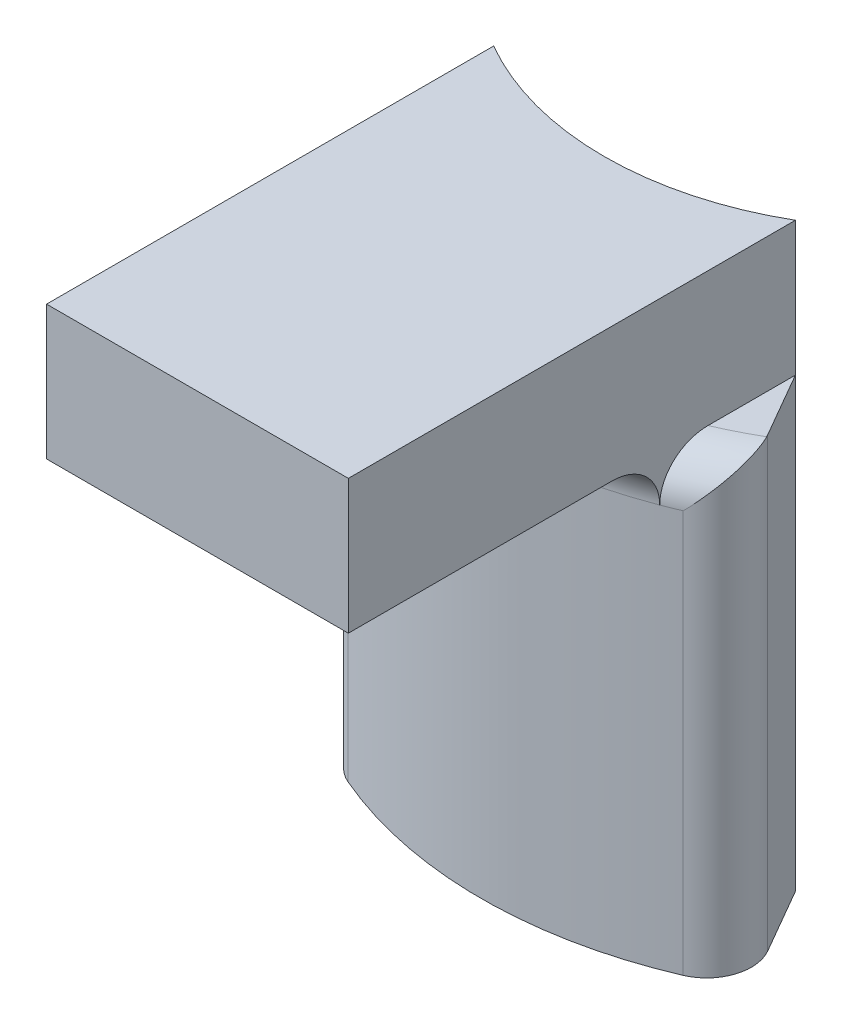
ISO-10303-21;
HEADER;
FILE_DESCRIPTION(('STEP AP214'),'2;1');
FILE_NAME('part.step','',(''),(''),'','','');
FILE_SCHEMA(('AUTOMOTIVE_DESIGN { 1 0 10303 214 1 1 1 1 }'));
ENDSEC;
DATA;
#1=APPLICATION_CONTEXT('core data for automotive mechanical design processes');
#2=APPLICATION_PROTOCOL_DEFINITION('international standard','automotive_design',2000,#1);
#3=PRODUCT_CONTEXT('',#1,'mechanical');
#4=PRODUCT('Part','Part','',(#3));
#5=PRODUCT_RELATED_PRODUCT_CATEGORY('part','',(#4));
#6=PRODUCT_DEFINITION_FORMATION('','',#4);
#7=PRODUCT_DEFINITION_CONTEXT('part definition',#1,'design');
#8=PRODUCT_DEFINITION('design','',#6,#7);
#9=PRODUCT_DEFINITION_SHAPE('','',#8);
#10=(LENGTH_UNIT() NAMED_UNIT(*) SI_UNIT(.MILLI.,.METRE.));
#11=(NAMED_UNIT(*) PLANE_ANGLE_UNIT() SI_UNIT($,.RADIAN.));
#12=(NAMED_UNIT(*) SI_UNIT($,.STERADIAN.) SOLID_ANGLE_UNIT());
#13=UNCERTAINTY_MEASURE_WITH_UNIT(LENGTH_MEASURE(1.E-05),#10,'distance_accuracy_value','');
#14=(GEOMETRIC_REPRESENTATION_CONTEXT(3) GLOBAL_UNCERTAINTY_ASSIGNED_CONTEXT((#13)) GLOBAL_UNIT_ASSIGNED_CONTEXT((#10,
#11,#12)) REPRESENTATION_CONTEXT('',''));
#15=CARTESIAN_POINT('',(0.,0.,0.));
#16=DIRECTION('',(0.,0.,1.));
#17=DIRECTION('',(1.,0.,0.));
#18=AXIS2_PLACEMENT_3D('',#15,#16,#17);
#19=CARTESIAN_POINT('',(0.,10.,0.));
#20=DIRECTION('',(0.,1.,0.));
#21=DIRECTION('',(0.,0.,1.));
#22=AXIS2_PLACEMENT_3D('',#19,#20,#21);
#23=PLANE('',#22);
#24=CARTESIAN_POINT('',(0.,10.,0.));
#25=DIRECTION('',(0.,1.,0.));
#26=DIRECTION('',(0.,0.,1.));
#27=AXIS2_PLACEMENT_3D('',#24,#25,#26);
#28=CIRCLE('',#27,8.5);
#29=CARTESIAN_POINT('',(3.375,10.,7.80124188831497));
#30=VERTEX_POINT('',#29);
#31=CARTESIAN_POINT('',(4.24848982978405,10.,7.36208762282965));
#32=VERTEX_POINT('',#31);
#33=EDGE_CURVE('E247',#30,#32,#28,.T.);
#34=ORIENTED_EDGE('',*,*,#33,.T.);
#35=CARTESIAN_POINT('',(3.3544603502491,10.,7.81009575860673));
#36=DIRECTION('',(0.,1.,0.));
#37=DIRECTION('',(0.,0.,1.));
#38=AXIS2_PLACEMENT_3D('',#35,#36,#37);
#39=CIRCLE('',#38,1.);
#40=CARTESIAN_POINT('',(4.22048575403353,10.,7.31009575860673));
#41=VERTEX_POINT('',#40);
#42=EDGE_CURVE('E11',#32,#41,#39,.T.);
#43=ORIENTED_EDGE('',*,*,#42,.T.);
#44=DIRECTION('',(0.5,0.,0.866025403784439));
#45=VECTOR('',#44,1.);
#46=CARTESIAN_POINT('',(0.,10.,0.));
#47=LINE('',#46,#45);
#48=CARTESIAN_POINT('',(3.375,10.,5.84567147554496));
#49=VERTEX_POINT('',#48);
#50=EDGE_CURVE('E174',#49,#41,#47,.T.);
#51=ORIENTED_EDGE('',*,*,#50,.F.);
#52=DIRECTION('',(0.,0.,-1.));
#53=VECTOR('',#52,1.);
#54=CARTESIAN_POINT('',(3.375,10.,15.845671475545));
#55=LINE('',#54,#53);
#56=EDGE_CURVE('E190',#30,#49,#55,.T.);
#57=ORIENTED_EDGE('',*,*,#56,.F.);
#58=EDGE_LOOP('',(#34,#43,#51,#57));
#59=FACE_BOUND('',#58,.T.);
#60=ADVANCED_FACE('F43',(#59),#23,.T.);
#61=CARTESIAN_POINT('',(0.,10.,0.));
#62=DIRECTION('',(0.,-1.,0.));
#63=DIRECTION('',(0.,0.,-1.));
#64=AXIS2_PLACEMENT_3D('',#61,#62,#63);
#65=CYLINDRICAL_SURFACE('',#64,9.5);
#66=CARTESIAN_POINT('',(0.,0.,0.));
#67=DIRECTION('',(0.,1.,0.));
#68=DIRECTION('',(0.,0.,1.));
#69=AXIS2_PLACEMENT_3D('',#66,#67,#68);
#70=CIRCLE('',#69,9.5);
#71=CARTESIAN_POINT('',(3.74910274439605,0.,8.72893055373693));
#72=VERTEX_POINT('',#71);
#73=CARTESIAN_POINT('',(-3.74910274439605,0.,8.72893055373693));
#74=VERTEX_POINT('',#73);
#75=EDGE_CURVE('E166',#72,#74,#70,.F.);
#76=ORIENTED_EDGE('',*,*,#75,.F.);
#77=DIRECTION('',(0.,-1.,0.));
#78=VECTOR('',#77,1.);
#79=CARTESIAN_POINT('',(3.74910274439605,10.,8.72893055373693));
#80=LINE('',#79,#78);
#81=CARTESIAN_POINT('',(3.74910274439605,9.,8.72893055373693));
#82=VERTEX_POINT('',#81);
#83=EDGE_CURVE('E66',#72,#82,#80,.F.);
#84=ORIENTED_EDGE('',*,*,#83,.T.);
#85=CARTESIAN_POINT('',(0.,9.,0.));
#86=DIRECTION('',(0.,1.,0.));
#87=DIRECTION('',(0.,0.,1.));
#88=AXIS2_PLACEMENT_3D('',#85,#86,#87);
#89=CIRCLE('',#88,9.5);
#90=CARTESIAN_POINT('',(3.375,9.,8.8802801194557));
#91=VERTEX_POINT('',#90);
#92=EDGE_CURVE('E303',#82,#91,#89,.F.);
#93=ORIENTED_EDGE('',*,*,#92,.T.);
#94=CARTESIAN_POINT('',(0.,9.,0.));
#95=DIRECTION('',(0.,-1.,0.));
#96=DIRECTION('',(0.,0.,-1.));
#97=AXIS2_PLACEMENT_3D('',#94,#95,#96);
#98=CIRCLE('',#97,9.5);
#99=CARTESIAN_POINT('',(-3.375,9.,8.8802801194557));
#100=VERTEX_POINT('',#99);
#101=EDGE_CURVE('E191',#91,#100,#98,.T.);
#102=ORIENTED_EDGE('',*,*,#101,.T.);
#103=CARTESIAN_POINT('',(0.,9.,0.));
#104=DIRECTION('',(0.,1.,0.));
#105=DIRECTION('',(0.,0.,1.));
#106=AXIS2_PLACEMENT_3D('',#103,#104,#105);
#107=CIRCLE('',#106,9.5);
#108=CARTESIAN_POINT('',(-3.74910274439605,9.,8.72893055373693));
#109=VERTEX_POINT('',#108);
#110=EDGE_CURVE('E308',#100,#109,#107,.F.);
#111=ORIENTED_EDGE('',*,*,#110,.T.);
#112=DIRECTION('',(0.,-1.,0.));
#113=VECTOR('',#112,1.);
#114=CARTESIAN_POINT('',(-3.74910274439605,10.,8.72893055373693));
#115=LINE('',#114,#113);
#116=EDGE_CURVE('E299',#109,#74,#115,.T.);
#117=ORIENTED_EDGE('',*,*,#116,.T.);
#118=EDGE_LOOP('',(#76,#84,#93,#102,#111,#117));
#119=FACE_BOUND('',#118,.T.);
#120=ADVANCED_FACE('F221',(#119),#65,.T.);
#121=CARTESIAN_POINT('',(0.,10.,0.));
#122=DIRECTION('',(0.866025403784439,0.,-0.5));
#123=DIRECTION('',(-0.5,0.,-0.866025403784439));
#124=AXIS2_PLACEMENT_3D('',#121,#122,#123);
#125=PLANE('',#124);
#126=ORIENTED_EDGE('',*,*,#50,.T.);
#127=DIRECTION('',(0.,-1.,0.));
#128=VECTOR('',#127,1.);
#129=CARTESIAN_POINT('',(4.22048575403353,10.,7.31009575860673));
#130=LINE('',#129,#128);
#131=CARTESIAN_POINT('',(4.22048575403353,0.,7.31009575860673));
#132=VERTEX_POINT('',#131);
#133=EDGE_CURVE('E257',#41,#132,#130,.T.);
#134=ORIENTED_EDGE('',*,*,#133,.T.);
#135=DIRECTION('',(0.5,0.,0.866025403784439));
#136=VECTOR('',#135,1.);
#137=CARTESIAN_POINT('',(0.,0.,0.));
#138=LINE('',#137,#136);
#139=CARTESIAN_POINT('',(3.375,0.,5.84567147554496));
#140=VERTEX_POINT('',#139);
#141=EDGE_CURVE('E168',#140,#132,#138,.T.);
#142=ORIENTED_EDGE('',*,*,#141,.F.);
#143=DIRECTION('',(0.,-1.,0.));
#144=VECTOR('',#143,1.);
#145=CARTESIAN_POINT('',(3.375,10.,5.84567147554496));
#146=LINE('',#145,#144);
#147=EDGE_CURVE('E188',#49,#140,#146,.T.);
#148=ORIENTED_EDGE('',*,*,#147,.F.);
#149=EDGE_LOOP('',(#126,#134,#142,#148));
#150=FACE_BOUND('',#149,.T.);
#151=ADVANCED_FACE('F277',(#150),#125,.T.);
#152=CARTESIAN_POINT('',(0.,10.,0.));
#153=DIRECTION('',(0.,-1.,0.));
#154=DIRECTION('',(0.,0.,-1.));
#155=AXIS2_PLACEMENT_3D('',#152,#153,#154);
#156=CYLINDRICAL_SURFACE('',#155,6.75);
#157=CARTESIAN_POINT('',(0.,0.,0.));
#158=DIRECTION('',(0.,1.,0.));
#159=DIRECTION('',(0.,0.,1.));
#160=AXIS2_PLACEMENT_3D('',#157,#158,#159);
#161=CIRCLE('',#160,6.75);
#162=CARTESIAN_POINT('',(-3.375,0.,5.84567147554496));
#163=VERTEX_POINT('',#162);
#164=EDGE_CURVE('E183',#140,#163,#161,.F.);
#165=ORIENTED_EDGE('',*,*,#164,.T.);
#166=DIRECTION('',(0.,-1.,0.));
#167=VECTOR('',#166,1.);
#168=CARTESIAN_POINT('',(-3.375,10.,5.84567147554496));
#169=LINE('',#168,#167);
#170=CARTESIAN_POINT('',(-3.375,10.,5.84567147554496));
#171=VERTEX_POINT('',#170);
#172=EDGE_CURVE('E164',#171,#163,#169,.T.);
#173=ORIENTED_EDGE('',*,*,#172,.F.);
#174=DIRECTION('',(0.,-1.,0.));
#175=VECTOR('',#174,1.);
#176=CARTESIAN_POINT('',(-3.375,13.,5.84567147554496));
#177=LINE('',#176,#175);
#178=CARTESIAN_POINT('',(-3.375,13.,5.84567147554496));
#179=VERTEX_POINT('',#178);
#180=EDGE_CURVE('E144',#179,#171,#177,.T.);
#181=ORIENTED_EDGE('',*,*,#180,.F.);
#182=CARTESIAN_POINT('',(0.,13.,0.));
#183=DIRECTION('',(0.,-1.,0.));
#184=DIRECTION('',(0.,0.,-1.));
#185=AXIS2_PLACEMENT_3D('',#182,#183,#184);
#186=CIRCLE('',#185,6.75);
#187=CARTESIAN_POINT('',(3.375,13.,5.84567147554496));
#188=VERTEX_POINT('',#187);
#189=EDGE_CURVE('E150',#188,#179,#186,.T.);
#190=ORIENTED_EDGE('',*,*,#189,.F.);
#191=DIRECTION('',(0.,-1.,0.));
#192=VECTOR('',#191,1.);
#193=CARTESIAN_POINT('',(3.375,13.,5.84567147554496));
#194=LINE('',#193,#192);
#195=EDGE_CURVE('E458',#188,#49,#194,.T.);
#196=ORIENTED_EDGE('',*,*,#195,.T.);
#197=ORIENTED_EDGE('',*,*,#147,.T.);
#198=EDGE_LOOP('',(#165,#173,#181,#190,#196,#197));
#199=FACE_BOUND('',#198,.T.);
#200=ADVANCED_FACE('F162',(#199),#156,.F.);
#201=CARTESIAN_POINT('',(0.,10.,0.));
#202=DIRECTION('',(0.866025403784439,0.,0.5));
#203=DIRECTION('',(0.5,0.,-0.866025403784439));
#204=AXIS2_PLACEMENT_3D('',#201,#202,#203);
#205=PLANE('',#204);
#206=DIRECTION('',(-0.5,0.,0.866025403784439));
#207=VECTOR('',#206,1.);
#208=CARTESIAN_POINT('',(0.,0.,0.));
#209=LINE('',#208,#207);
#210=CARTESIAN_POINT('',(-4.22048575403353,0.,7.31009575860673));
#211=VERTEX_POINT('',#210);
#212=EDGE_CURVE('E178',#163,#211,#209,.T.);
#213=ORIENTED_EDGE('',*,*,#212,.T.);
#214=DIRECTION('',(0.,1.,0.));
#215=VECTOR('',#214,1.);
#216=CARTESIAN_POINT('',(-4.22048575403353,9.,7.31009575860673));
#217=LINE('',#216,#215);
#218=CARTESIAN_POINT('',(-4.22048575403353,10.,7.31009575860673));
#219=VERTEX_POINT('',#218);
#220=EDGE_CURVE('E288',#211,#219,#217,.T.);
#221=ORIENTED_EDGE('',*,*,#220,.T.);
#222=DIRECTION('',(-0.5,0.,0.866025403784439));
#223=VECTOR('',#222,1.);
#224=CARTESIAN_POINT('',(0.,10.,0.));
#225=LINE('',#224,#223);
#226=EDGE_CURVE('E177',#171,#219,#225,.T.);
#227=ORIENTED_EDGE('',*,*,#226,.F.);
#228=ORIENTED_EDGE('',*,*,#172,.T.);
#229=EDGE_LOOP('',(#213,#221,#227,#228));
#230=FACE_BOUND('',#229,.T.);
#231=ADVANCED_FACE('F286',(#230),#205,.F.);
#232=ORIENTED_EDGE('',*,*,#226,.T.);
#233=CARTESIAN_POINT('',(-3.3544603502491,10.,7.81009575860673));
#234=DIRECTION('',(0.,1.,0.));
#235=DIRECTION('',(0.,0.,1.));
#236=AXIS2_PLACEMENT_3D('',#233,#234,#235);
#237=CIRCLE('',#236,1.);
#238=CARTESIAN_POINT('',(-4.24848982978405,10.,7.36208762282965));
#239=VERTEX_POINT('',#238);
#240=EDGE_CURVE('E248',#219,#239,#237,.T.);
#241=ORIENTED_EDGE('',*,*,#240,.T.);
#242=CARTESIAN_POINT('',(0.,10.,0.));
#243=DIRECTION('',(0.,1.,0.));
#244=DIRECTION('',(0.,0.,1.));
#245=AXIS2_PLACEMENT_3D('',#242,#243,#244);
#246=CIRCLE('',#245,8.5);
#247=CARTESIAN_POINT('',(-3.375,10.,7.80124188831497));
#248=VERTEX_POINT('',#247);
#249=EDGE_CURVE('E305',#239,#248,#246,.T.);
#250=ORIENTED_EDGE('',*,*,#249,.T.);
#251=DIRECTION('',(0.,0.,1.));
#252=VECTOR('',#251,1.);
#253=CARTESIAN_POINT('',(-3.375,10.,5.84567147554496));
#254=LINE('',#253,#252);
#255=EDGE_CURVE('E293',#171,#248,#254,.T.);
#256=ORIENTED_EDGE('',*,*,#255,.F.);
#257=EDGE_LOOP('',(#232,#241,#250,#256));
#258=FACE_BOUND('',#257,.T.);
#259=ADVANCED_FACE('F291',(#258),#23,.T.);
#260=CARTESIAN_POINT('',(0.,0.,0.));
#261=DIRECTION('',(0.,1.,0.));
#262=DIRECTION('',(0.,0.,1.));
#263=AXIS2_PLACEMENT_3D('',#260,#261,#262);
#264=PLANE('',#263);
#265=ORIENTED_EDGE('',*,*,#141,.T.);
#266=CARTESIAN_POINT('',(3.3544603502491,0.,7.81009575860673));
#267=DIRECTION('',(0.,1.,0.));
#268=DIRECTION('',(0.,0.,1.));
#269=AXIS2_PLACEMENT_3D('',#266,#267,#268);
#270=CIRCLE('',#269,1.);
#271=EDGE_CURVE('E271',#132,#72,#270,.F.);
#272=ORIENTED_EDGE('',*,*,#271,.T.);
#273=ORIENTED_EDGE('',*,*,#75,.T.);
#274=CARTESIAN_POINT('',(-3.3544603502491,0.,7.81009575860673));
#275=DIRECTION('',(0.,1.,0.));
#276=DIRECTION('',(0.,0.,1.));
#277=AXIS2_PLACEMENT_3D('',#274,#275,#276);
#278=CIRCLE('',#277,1.);
#279=EDGE_CURVE('E298',#74,#211,#278,.F.);
#280=ORIENTED_EDGE('',*,*,#279,.T.);
#281=ORIENTED_EDGE('',*,*,#212,.F.);
#282=ORIENTED_EDGE('',*,*,#164,.F.);
#283=EDGE_LOOP('',(#265,#272,#273,#280,#281,#282));
#284=FACE_BOUND('',#283,.T.);
#285=ADVANCED_FACE('F283',(#284),#264,.F.);
#286=CARTESIAN_POINT('',(0.,10.,0.));
#287=DIRECTION('',(0.,-1.,0.));
#288=DIRECTION('',(0.,0.,-1.));
#289=AXIS2_PLACEMENT_3D('',#286,#287,#288);
#290=PLANE('',#289);
#291=CARTESIAN_POINT('',(-3.375,10.,9.94280518767214));
#292=VERTEX_POINT('',#291);
#293=CARTESIAN_POINT('',(-3.375,10.,15.845671475545));
#294=VERTEX_POINT('',#293);
#295=EDGE_CURVE('E454',#292,#294,#254,.T.);
#296=ORIENTED_EDGE('',*,*,#295,.F.);
#297=CARTESIAN_POINT('',(0.,10.,0.));
#298=DIRECTION('',(0.,-1.,0.));
#299=DIRECTION('',(0.,0.,-1.));
#300=AXIS2_PLACEMENT_3D('',#297,#298,#299);
#301=CIRCLE('',#300,10.5);
#302=CARTESIAN_POINT('',(3.375,10.,9.94280518767214));
#303=VERTEX_POINT('',#302);
#304=EDGE_CURVE('E194',#292,#303,#301,.F.);
#305=ORIENTED_EDGE('',*,*,#304,.T.);
#306=CARTESIAN_POINT('',(3.375,10.,15.845671475545));
#307=VERTEX_POINT('',#306);
#308=EDGE_CURVE('E159',#307,#303,#55,.T.);
#309=ORIENTED_EDGE('',*,*,#308,.F.);
#310=DIRECTION('',(1.,0.,0.));
#311=VECTOR('',#310,1.);
#312=CARTESIAN_POINT('',(-3.375,10.,15.845671475545));
#313=LINE('',#312,#311);
#314=EDGE_CURVE('E451',#294,#307,#313,.T.);
#315=ORIENTED_EDGE('',*,*,#314,.F.);
#316=EDGE_LOOP('',(#296,#305,#309,#315));
#317=FACE_BOUND('',#316,.T.);
#318=ADVANCED_FACE('F336',(#317),#290,.T.);
#319=CARTESIAN_POINT('',(-3.375,13.,5.84567147554496));
#320=DIRECTION('',(1.,0.,0.));
#321=DIRECTION('',(0.,0.,-1.));
#322=AXIS2_PLACEMENT_3D('',#319,#320,#321);
#323=PLANE('',#322);
#324=ORIENTED_EDGE('',*,*,#255,.T.);
#325=CARTESIAN_POINT('',(-3.375,10.,7.80124188831497));
#326=CARTESIAN_POINT('',(-3.375,10.0000346658048,7.86592552229235));
#327=CARTESIAN_POINT('',(-3.375,9.99471400042197,7.9306447502143));
#328=CARTESIAN_POINT('',(-3.375,9.97343460654505,8.05845794448718));
#329=CARTESIAN_POINT('',(-3.375,9.95745136693728,8.1215478173755));
#330=CARTESIAN_POINT('',(-3.375,9.91488197758728,8.24420023686653));
#331=CARTESIAN_POINT('',(-3.375,9.88827686908855,8.3037562564612));
#332=CARTESIAN_POINT('',(-3.375,9.82492911130939,8.41715278248652));
#333=CARTESIAN_POINT('',(-3.375,9.78819836882685,8.4709998997105));
#334=CARTESIAN_POINT('',(-3.375,9.70758855315847,8.56836466432147));
#335=CARTESIAN_POINT('',(-3.375,9.66418620477093,8.61227627699532));
#336=CARTESIAN_POINT('',(-3.375,9.57008522622251,8.69149011833435));
#337=CARTESIAN_POINT('',(-3.375,9.51938663862359,8.72679239721807));
#338=CARTESIAN_POINT('',(-3.375,9.41623121318694,8.78499619078137));
#339=CARTESIAN_POINT('',(-3.375,9.36418174687973,8.80862176423506));
#340=CARTESIAN_POINT('',(-3.375,9.25673553301048,8.84617561583557));
#341=CARTESIAN_POINT('',(-3.375,9.20134453754303,8.86012006893928));
#342=CARTESIAN_POINT('',(-3.375,9.12118622725833,8.87271520324709));
#343=CARTESIAN_POINT('',(-3.375,9.09701703630503,8.87555168374936));
#344=CARTESIAN_POINT('',(-3.375,9.04856946142617,8.87933226940889));
#345=CARTESIAN_POINT('',(-3.375,9.02429130988889,8.88027935264026));
#346=CARTESIAN_POINT('',(-3.375,9.00000000000002,8.88028011945582));
#347=B_SPLINE_CURVE_WITH_KNOTS('',3,(#325,#326,#327,#328,#329,#330,#331,#332,#333,#334,#335,
#336,#337,#338,#339,#340,#341,#342,#343,#344,#345,#346),.UNSPECIFIED.,.F.,.F.,(4,2,2,2,2,2,2,2,
2,2,4),(0.,0.193889983362494,0.388227223783559,0.58291289470255,0.777370602908646,
0.961615777229496,1.14585987681624,1.31647716474582,1.48680869937559,1.55975315733141,
1.63258254886743),.UNSPECIFIED.);
#348=EDGE_CURVE('E232',#248,#100,#347,.T.);
#349=ORIENTED_EDGE('',*,*,#348,.T.);
#350=CARTESIAN_POINT('',(-3.375,9.,8.8802801194557));
#351=CARTESIAN_POINT('',(-3.375,9.02685240975403,8.88027923352258));
#352=CARTESIAN_POINT('',(-3.375,9.05369140249803,8.88143798382992));
#353=CARTESIAN_POINT('',(-3.375,9.10716589830348,8.88605350982042));
#354=CARTESIAN_POINT('',(-3.375,9.13380143982684,8.8895098397021));
#355=CARTESIAN_POINT('',(-3.375,9.21296835610502,8.90326182958111));
#356=CARTESIAN_POINT('',(-3.375,9.26495050814498,8.91694083391108));
#357=CARTESIAN_POINT('',(-3.375,9.36584686553652,8.95278264588013));
#358=CARTESIAN_POINT('',(-3.375,9.41476175116081,8.97494356455995));
#359=CARTESIAN_POINT('',(-3.375,9.50834049911986,9.02694075115643));
#360=CARTESIAN_POINT('',(-3.375,9.55300275605204,9.05677990205434));
#361=CARTESIAN_POINT('',(-3.375,9.63825295399768,9.12410286790123));
#362=CARTESIAN_POINT('',(-3.375,9.67868546909502,9.16178302573573));
#363=CARTESIAN_POINT('',(-3.375,9.75309953756361,9.2430480899476));
#364=CARTESIAN_POINT('',(-3.375,9.78707924923451,9.28663467601969));
#365=CARTESIAN_POINT('',(-3.375,9.84980168354394,9.38131298683146));
#366=CARTESIAN_POINT('',(-3.375,9.87809767359176,9.43270053425846));
#367=CARTESIAN_POINT('',(-3.375,9.92614710180123,9.53932783955938));
#368=CARTESIAN_POINT('',(-3.375,9.94589949713071,9.59456806673677));
#369=CARTESIAN_POINT('',(-3.375,9.97406710654134,9.69853019265991));
#370=CARTESIAN_POINT('',(-3.375,9.98377908499264,9.74690599258163));
#371=CARTESIAN_POINT('',(-3.375,9.99674654896797,9.84445281502164));
#372=CARTESIAN_POINT('',(-3.375,10.0000101923368,9.89362275332618));
#373=CARTESIAN_POINT('',(-3.375,10.,9.94280518767214));
#374=B_SPLINE_CURVE_WITH_KNOTS('',3,(#350,#351,#352,#353,#354,#355,#356,#357,#358,#359,#360,
#361,#362,#363,#364,#365,#366,#367,#368,#369,#370,#371,#372,#373),.UNSPECIFIED.,.F.,.F.,(4,2,2,
2,2,2,2,2,2,2,2,4),(0.,0.0805058824394552,0.160996148806727,0.321412760902189,0.481793668287508,
0.642234882725191,0.807321904216137,0.972455972757358,1.14767795932327,1.32292132747366,
1.47052473514496,1.61794128859162),.UNSPECIFIED.);
#375=EDGE_CURVE('E196',#100,#292,#374,.T.);
#376=ORIENTED_EDGE('',*,*,#375,.T.);
#377=ORIENTED_EDGE('',*,*,#295,.T.);
#378=DIRECTION('',(0.,-1.,0.));
#379=VECTOR('',#378,1.);
#380=CARTESIAN_POINT('',(-3.375,13.,15.845671475545));
#381=LINE('',#380,#379);
#382=CARTESIAN_POINT('',(-3.375,13.,15.845671475545));
#383=VERTEX_POINT('',#382);
#384=EDGE_CURVE('E146',#383,#294,#381,.T.);
#385=ORIENTED_EDGE('',*,*,#384,.F.);
#386=DIRECTION('',(0.,0.,1.));
#387=VECTOR('',#386,1.);
#388=CARTESIAN_POINT('',(-3.375,13.,5.84567147554496));
#389=LINE('',#388,#387);
#390=EDGE_CURVE('E139',#179,#383,#389,.T.);
#391=ORIENTED_EDGE('',*,*,#390,.F.);
#392=ORIENTED_EDGE('',*,*,#180,.T.);
#393=EDGE_LOOP('',(#324,#349,#376,#377,#385,#391,#392));
#394=FACE_BOUND('',#393,.T.);
#395=ADVANCED_FACE('F142',(#394),#323,.F.);
#396=CARTESIAN_POINT('',(-3.375,13.,15.845671475545));
#397=DIRECTION('',(0.,0.,-1.));
#398=DIRECTION('',(-1.,0.,0.));
#399=AXIS2_PLACEMENT_3D('',#396,#397,#398);
#400=PLANE('',#399);
#401=ORIENTED_EDGE('',*,*,#314,.T.);
#402=DIRECTION('',(0.,-1.,0.));
#403=VECTOR('',#402,1.);
#404=CARTESIAN_POINT('',(3.375,13.,15.845671475545));
#405=LINE('',#404,#403);
#406=CARTESIAN_POINT('',(3.375,13.,15.845671475545));
#407=VERTEX_POINT('',#406);
#408=EDGE_CURVE('E170',#407,#307,#405,.T.);
#409=ORIENTED_EDGE('',*,*,#408,.F.);
#410=DIRECTION('',(1.,0.,0.));
#411=VECTOR('',#410,1.);
#412=CARTESIAN_POINT('',(-3.375,13.,15.845671475545));
#413=LINE('',#412,#411);
#414=EDGE_CURVE('E149',#383,#407,#413,.T.);
#415=ORIENTED_EDGE('',*,*,#414,.F.);
#416=ORIENTED_EDGE('',*,*,#384,.T.);
#417=EDGE_LOOP('',(#401,#409,#415,#416));
#418=FACE_BOUND('',#417,.T.);
#419=ADVANCED_FACE('F361',(#418),#400,.F.);
#420=CARTESIAN_POINT('',(3.375,13.,15.845671475545));
#421=DIRECTION('',(-1.,0.,0.));
#422=DIRECTION('',(0.,0.,1.));
#423=AXIS2_PLACEMENT_3D('',#420,#421,#422);
#424=PLANE('',#423);
#425=ORIENTED_EDGE('',*,*,#308,.T.);
#426=CARTESIAN_POINT('',(3.375,10.,9.94280518767214));
#427=CARTESIAN_POINT('',(3.375,10.0000336470942,9.88041128270838));
#428=CARTESIAN_POINT('',(3.375,9.99476526536256,9.81802195742589));
#429=CARTESIAN_POINT('',(3.375,9.97392163574734,9.69494403464997));
#430=CARTESIAN_POINT('',(3.375,9.95833916439605,9.6342566601887));
#431=CARTESIAN_POINT('',(3.375,9.91714907999727,9.51631998094233));
#432=CARTESIAN_POINT('',(3.375,9.89153355413567,9.45907343105333));
#433=CARTESIAN_POINT('',(3.375,9.83085241280632,9.34984797879999));
#434=CARTESIAN_POINT('',(3.375,9.79579163035002,9.29786640108545));
#435=CARTESIAN_POINT('',(3.375,9.71792902734889,9.20201691665275));
#436=CARTESIAN_POINT('',(3.375,9.67532276031962,9.15799052939433));
#437=CARTESIAN_POINT('',(3.375,9.5829063437822,9.07823991977272));
#438=CARTESIAN_POINT('',(3.375,9.53309643381527,9.04251542145151));
#439=CARTESIAN_POINT('',(3.375,9.43078221934457,8.98266488088708));
#440=CARTESIAN_POINT('',(3.375,9.37859968818639,8.95798812445146));
#441=CARTESIAN_POINT('',(3.375,9.27068721458895,8.91841147488483));
#442=CARTESIAN_POINT('',(3.375,9.21496308567532,8.90349599129201));
#443=CARTESIAN_POINT('',(3.375,9.13223804439382,8.88929317929735));
#444=CARTESIAN_POINT('',(3.375,9.10588520795699,8.88591473667357));
#445=CARTESIAN_POINT('',(3.375,9.05302637191275,8.88140982958213));
#446=CARTESIAN_POINT('',(3.375,9.02652065042859,8.88028010070052));
#447=CARTESIAN_POINT('',(3.375,9.00000000000001,8.88028011945568));
#448=B_SPLINE_CURVE_WITH_KNOTS('',3,(#426,#427,#428,#429,#430,#431,#432,#433,#434,#435,#436,
#437,#438,#439,#440,#441,#442,#443,#444,#445,#446,#447),.UNSPECIFIED.,.F.,.F.,(4,2,2,2,2,2,2,2,
2,2,4),(0.,0.186957045350577,0.374045164714538,0.561281133776989,0.748421478075559,
0.931278360441894,1.11412916370464,1.28641918810192,1.45843335920128,1.53805750978741,
1.61756598699867),.UNSPECIFIED.);
#449=EDGE_CURVE('E204',#303,#91,#448,.T.);
#450=ORIENTED_EDGE('',*,*,#449,.T.);
#451=CARTESIAN_POINT('',(3.375,9.,8.8802801194557));
#452=CARTESIAN_POINT('',(3.375,9.02676762831007,8.88028078506063));
#453=CARTESIAN_POINT('',(3.375,9.05352198160808,8.87912956264735));
#454=CARTESIAN_POINT('',(3.375,9.10682967816071,8.87454266070531));
#455=CARTESIAN_POINT('',(3.375,9.13338305436601,8.87110736423756));
#456=CARTESIAN_POINT('',(3.375,9.21231995389556,8.85743383015678));
#457=CARTESIAN_POINT('',(3.375,9.26415872486951,8.84382765133154));
#458=CARTESIAN_POINT('',(3.375,9.36478652533999,8.80814257099675));
#459=CARTESIAN_POINT('',(3.375,9.41357585526326,8.78606450566074));
#460=CARTESIAN_POINT('',(3.375,9.50689452122926,8.73422180847757));
#461=CARTESIAN_POINT('',(3.375,9.55142259530429,8.70445490918319));
#462=CARTESIAN_POINT('',(3.375,9.63621946410253,8.63739139481542));
#463=CARTESIAN_POINT('',(3.375,9.67635318663294,8.59992443405023));
#464=CARTESIAN_POINT('',(3.375,9.75020503769714,8.51913740148276));
#465=CARTESIAN_POINT('',(3.375,9.78392191915638,8.47581619473472));
#466=CARTESIAN_POINT('',(3.375,9.84622693257144,8.38171933089786));
#467=CARTESIAN_POINT('',(3.375,9.87436819711257,8.33064818659603));
#468=CARTESIAN_POINT('',(3.375,9.92233428208388,8.22472120397012));
#469=CARTESIAN_POINT('',(3.375,9.94215454560532,8.16986331097019));
#470=CARTESIAN_POINT('',(3.375,9.97181121970239,8.0629678849689));
#471=CARTESIAN_POINT('',(3.375,9.98239915881531,8.01113608419854));
#472=CARTESIAN_POINT('',(3.375,9.99649324533714,7.90661286712611));
#473=CARTESIAN_POINT('',(3.375,10.0000123432297,7.85392320141353));
#474=CARTESIAN_POINT('',(3.375,10.,7.80124188831497));
#475=B_SPLINE_CURVE_WITH_KNOTS('',3,(#451,#452,#453,#454,#455,#456,#457,#458,#459,#460,#461,
#462,#463,#464,#465,#466,#467,#468,#469,#470,#471,#472,#473,#474),.UNSPECIFIED.,.F.,.F.,(4,2,2,
2,2,2,2,2,2,2,2,4),(0.,0.08025200652164,0.1604905574097,0.320439253452804,0.480372166649907,
0.640352298227399,0.804350668704163,0.968380878805942,1.14256822399416,1.31685083700779,
1.47507818805505,1.63301539303219),.UNSPECIFIED.);
#476=EDGE_CURVE('E251',#91,#30,#475,.T.);
#477=ORIENTED_EDGE('',*,*,#476,.T.);
#478=ORIENTED_EDGE('',*,*,#56,.T.);
#479=ORIENTED_EDGE('',*,*,#195,.F.);
#480=DIRECTION('',(0.,0.,-1.));
#481=VECTOR('',#480,1.);
#482=CARTESIAN_POINT('',(3.375,13.,15.845671475545));
#483=LINE('',#482,#481);
#484=EDGE_CURVE('E155',#407,#188,#483,.T.);
#485=ORIENTED_EDGE('',*,*,#484,.F.);
#486=ORIENTED_EDGE('',*,*,#408,.T.);
#487=EDGE_LOOP('',(#425,#450,#477,#478,#479,#485,#486));
#488=FACE_BOUND('',#487,.T.);
#489=ADVANCED_FACE('F259',(#488),#424,.F.);
#490=CARTESIAN_POINT('',(0.,13.,0.));
#491=DIRECTION('',(0.,-1.,0.));
#492=DIRECTION('',(0.,0.,-1.));
#493=AXIS2_PLACEMENT_3D('',#490,#491,#492);
#494=PLANE('',#493);
#495=ORIENTED_EDGE('',*,*,#189,.T.);
#496=ORIENTED_EDGE('',*,*,#390,.T.);
#497=ORIENTED_EDGE('',*,*,#414,.T.);
#498=ORIENTED_EDGE('',*,*,#484,.T.);
#499=EDGE_LOOP('',(#495,#496,#497,#498));
#500=FACE_BOUND('',#499,.T.);
#501=ADVANCED_FACE('F153',(#500),#494,.F.);
#502=CARTESIAN_POINT('',(0.,9.,0.));
#503=DIRECTION('',(0.,-1.,0.));
#504=DIRECTION('',(0.,0.,-1.));
#505=AXIS2_PLACEMENT_3D('',#502,#503,#504);
#506=TOROIDAL_SURFACE('',#505,10.5,1.);
#507=ORIENTED_EDGE('',*,*,#449,.F.);
#508=ORIENTED_EDGE('',*,*,#304,.F.);
#509=ORIENTED_EDGE('',*,*,#375,.F.);
#510=ORIENTED_EDGE('',*,*,#101,.F.);
#511=EDGE_LOOP('',(#507,#508,#509,#510));
#512=FACE_BOUND('',#511,.T.);
#513=ADVANCED_FACE('F214',(#512),#506,.F.);
#514=CARTESIAN_POINT('',(0.,9.,0.));
#515=DIRECTION('',(0.,1.,0.));
#516=DIRECTION('',(0.,0.,1.));
#517=AXIS2_PLACEMENT_3D('',#514,#515,#516);
#518=TOROIDAL_SURFACE('',#517,8.5,1.);
#519=ORIENTED_EDGE('',*,*,#249,.F.);
#520=CARTESIAN_POINT('',(-4.24848982978405,10.,7.36208762282965));
#521=CARTESIAN_POINT('',(-4.25867697463416,10.0000029815077,7.38240975796603));
#522=CARTESIAN_POINT('',(-4.26815814018474,9.9992269397949,7.40306865390755));
#523=CARTESIAN_POINT('',(-4.28565398006968,9.99617058024746,7.4448692447727));
#524=CARTESIAN_POINT('',(-4.2936699411354,9.99389159047532,7.46601049755956));
#525=CARTESIAN_POINT('',(-4.31532674132576,9.98493515099745,7.52952598342047));
#526=CARTESIAN_POINT('',(-4.32676958014528,9.97613603572469,7.57238073090057));
#527=CARTESIAN_POINT('',(-4.34374678231091,9.95365569904224,7.65775638519887));
#528=CARTESIAN_POINT('',(-4.34929979283279,9.93999006965766,7.70027791999149));
#529=CARTESIAN_POINT('',(-4.35501425429496,9.90861481756147,7.78424706532075));
#530=CARTESIAN_POINT('',(-4.35516285188923,9.89089565491221,7.82569188141902));
#531=CARTESIAN_POINT('',(-4.34968662638996,9.84444871429994,7.92308962503864));
#532=CARTESIAN_POINT('',(-4.34171338334639,9.81416088463491,7.97816600604648));
#533=CARTESIAN_POINT('',(-4.31782515186413,9.7490784023383,8.08371555592403));
#534=CARTESIAN_POINT('',(-4.30189704708136,9.71427637688324,8.13418095889021));
#535=CARTESIAN_POINT('',(-4.25697999603044,9.6291830920377,8.24625111114215));
#536=CARTESIAN_POINT('',(-4.22539623572584,9.57763218403671,8.30585619074007));
#537=CARTESIAN_POINT('',(-4.15304952453565,9.4710007641863,8.41555560170649));
#538=CARTESIAN_POINT('',(-4.11227393447116,9.41591546771931,8.46563666062978));
#539=CARTESIAN_POINT('',(-4.02209084502621,9.30195498675309,8.55744937513404));
#540=CARTESIAN_POINT('',(-3.97245456765565,9.24301522993081,8.59887336872057));
#541=CARTESIAN_POINT('',(-3.86715764760228,9.12422477407059,8.671026225456));
#542=CARTESIAN_POINT('',(-3.81151094149511,9.0643764476185,8.70177916233645));
#543=CARTESIAN_POINT('',(-3.75207660672417,9.00306307591337,8.72764898911047));
#544=CARTESIAN_POINT('',(-3.75059042502343,9.00153151117403,8.7282915881843));
#545=CARTESIAN_POINT('',(-3.74910274439605,9.,8.72893055373693));
#546=B_SPLINE_CURVE_WITH_KNOTS('',3,(#520,#521,#522,#523,#524,#525,#526,#527,#528,#529,#530,
#531,#532,#533,#534,#535,#536,#537,#538,#539,#540,#541,#542,#543,#544,#545),.UNSPECIFIED.,.F.,
.F.,(4,2,2,2,2,2,2,2,2,2,2,2,4),(0.,0.0681427979093962,0.136225462767999,0.271109063567281,
0.405564336888147,0.540339365092176,0.729373792292887,0.918720942373112,1.17206247788505,
1.42575451760632,1.68732656738216,1.94830461859668,1.95499087476383),.UNSPECIFIED.);
#547=EDGE_CURVE('E240',#239,#109,#546,.T.);
#548=ORIENTED_EDGE('',*,*,#547,.T.);
#549=ORIENTED_EDGE('',*,*,#110,.F.);
#550=ORIENTED_EDGE('',*,*,#348,.F.);
#551=EDGE_LOOP('',(#519,#548,#549,#550));
#552=FACE_BOUND('',#551,.T.);
#553=ADVANCED_FACE('F219',(#552),#518,.T.);
#554=CARTESIAN_POINT('',(-3.3544603502491,10.,7.81009575860673));
#555=DIRECTION('',(0.,-1.,0.));
#556=DIRECTION('',(0.,0.,-1.));
#557=AXIS2_PLACEMENT_3D('',#554,#555,#556);
#558=CYLINDRICAL_SURFACE('',#557,1.);
#559=ORIENTED_EDGE('',*,*,#240,.F.);
#560=ORIENTED_EDGE('',*,*,#220,.F.);
#561=ORIENTED_EDGE('',*,*,#279,.F.);
#562=ORIENTED_EDGE('',*,*,#116,.F.);
#563=ORIENTED_EDGE('',*,*,#547,.F.);
#564=EDGE_LOOP('',(#559,#560,#561,#562,#563));
#565=FACE_BOUND('',#564,.T.);
#566=ADVANCED_FACE('F227',(#565),#558,.T.);
#567=CARTESIAN_POINT('',(0.,9.,0.));
#568=DIRECTION('',(0.,1.,0.));
#569=DIRECTION('',(0.,0.,1.));
#570=AXIS2_PLACEMENT_3D('',#567,#568,#569);
#571=TOROIDAL_SURFACE('',#570,8.5,1.);
#572=ORIENTED_EDGE('',*,*,#92,.F.);
#573=CARTESIAN_POINT('',(4.24848982978405,10.,7.36208762282965));
#574=CARTESIAN_POINT('',(4.25867697463416,10.0000029815077,7.38240975796603));
#575=CARTESIAN_POINT('',(4.26815814018474,9.9992269397949,7.40306865390755));
#576=CARTESIAN_POINT('',(4.28565398006968,9.99617058024746,7.4448692447727));
#577=CARTESIAN_POINT('',(4.2936699411354,9.99389159047532,7.46601049755956));
#578=CARTESIAN_POINT('',(4.31532674132576,9.98493515099745,7.52952598342047));
#579=CARTESIAN_POINT('',(4.32676958014528,9.97613603572469,7.57238073090057));
#580=CARTESIAN_POINT('',(4.34374678231091,9.95365569904224,7.65775638519887));
#581=CARTESIAN_POINT('',(4.34929979283279,9.93999006965766,7.70027791999149));
#582=CARTESIAN_POINT('',(4.35501425429496,9.90861481756147,7.78424706532075));
#583=CARTESIAN_POINT('',(4.35516285188923,9.89089565491221,7.82569188141902));
#584=CARTESIAN_POINT('',(4.34968662638996,9.84444871429994,7.92308962503864));
#585=CARTESIAN_POINT('',(4.34171338334639,9.81416088463491,7.97816600604648));
#586=CARTESIAN_POINT('',(4.31782515186413,9.7490784023383,8.08371555592403));
#587=CARTESIAN_POINT('',(4.30189704708136,9.71427637688324,8.13418095889021));
#588=CARTESIAN_POINT('',(4.25697999603044,9.6291830920377,8.24625111114215));
#589=CARTESIAN_POINT('',(4.22539623572584,9.57763218403671,8.30585619074007));
#590=CARTESIAN_POINT('',(4.15304952453565,9.4710007641863,8.41555560170649));
#591=CARTESIAN_POINT('',(4.11227393447116,9.41591546771931,8.46563666062978));
#592=CARTESIAN_POINT('',(4.02209084502621,9.30195498675309,8.55744937513404));
#593=CARTESIAN_POINT('',(3.97245456765565,9.24301522993081,8.59887336872057));
#594=CARTESIAN_POINT('',(3.86715764760228,9.12422477407059,8.671026225456));
#595=CARTESIAN_POINT('',(3.81151094149511,9.0643764476185,8.70177916233645));
#596=CARTESIAN_POINT('',(3.75207660672417,9.00306307591337,8.72764898911047));
#597=CARTESIAN_POINT('',(3.75059042502343,9.00153151117403,8.7282915881843));
#598=CARTESIAN_POINT('',(3.74910274439605,9.,8.72893055373693));
#599=B_SPLINE_CURVE_WITH_KNOTS('',3,(#573,#574,#575,#576,#577,#578,#579,#580,#581,#582,#583,
#584,#585,#586,#587,#588,#589,#590,#591,#592,#593,#594,#595,#596,#597,#598),.UNSPECIFIED.,.F.,
.F.,(4,2,2,2,2,2,2,2,2,2,2,2,4),(0.,0.0681427979093962,0.136225462767999,0.271109063567281,
0.405564336888147,0.540339365092176,0.729373792292887,0.918720942373112,1.17206247788505,
1.42575451760632,1.68732656738216,1.94830461859668,1.95499087476383),.UNSPECIFIED.);
#600=EDGE_CURVE('E52',#82,#32,#599,.F.);
#601=ORIENTED_EDGE('',*,*,#600,.T.);
#602=ORIENTED_EDGE('',*,*,#33,.F.);
#603=ORIENTED_EDGE('',*,*,#476,.F.);
#604=EDGE_LOOP('',(#572,#601,#602,#603));
#605=FACE_BOUND('',#604,.T.);
#606=ADVANCED_FACE('F262',(#605),#571,.T.);
#607=CARTESIAN_POINT('',(3.3544603502491,10.,7.81009575860673));
#608=DIRECTION('',(0.,-1.,0.));
#609=DIRECTION('',(0.,0.,-1.));
#610=AXIS2_PLACEMENT_3D('',#607,#608,#609);
#611=CYLINDRICAL_SURFACE('',#610,1.);
#612=ORIENTED_EDGE('',*,*,#600,.F.);
#613=ORIENTED_EDGE('',*,*,#83,.F.);
#614=ORIENTED_EDGE('',*,*,#271,.F.);
#615=ORIENTED_EDGE('',*,*,#133,.F.);
#616=ORIENTED_EDGE('',*,*,#42,.F.);
#617=EDGE_LOOP('',(#612,#613,#614,#615,#616));
#618=FACE_BOUND('',#617,.T.);
#619=ADVANCED_FACE('F45',(#618),#611,.T.);
#620=CLOSED_SHELL('',(#60,#120,#151,#200,#231,#259,#285,#318,#395,#419,#489,#501,#513,#553,#566,
#606,#619));
#621=MANIFOLD_SOLID_BREP('B2',#620);
#622=ADVANCED_BREP_SHAPE_REPRESENTATION('',(#18,#621),#14);
#623=SHAPE_DEFINITION_REPRESENTATION(#9,#622);
ENDSEC;
END-ISO-10303-21;
